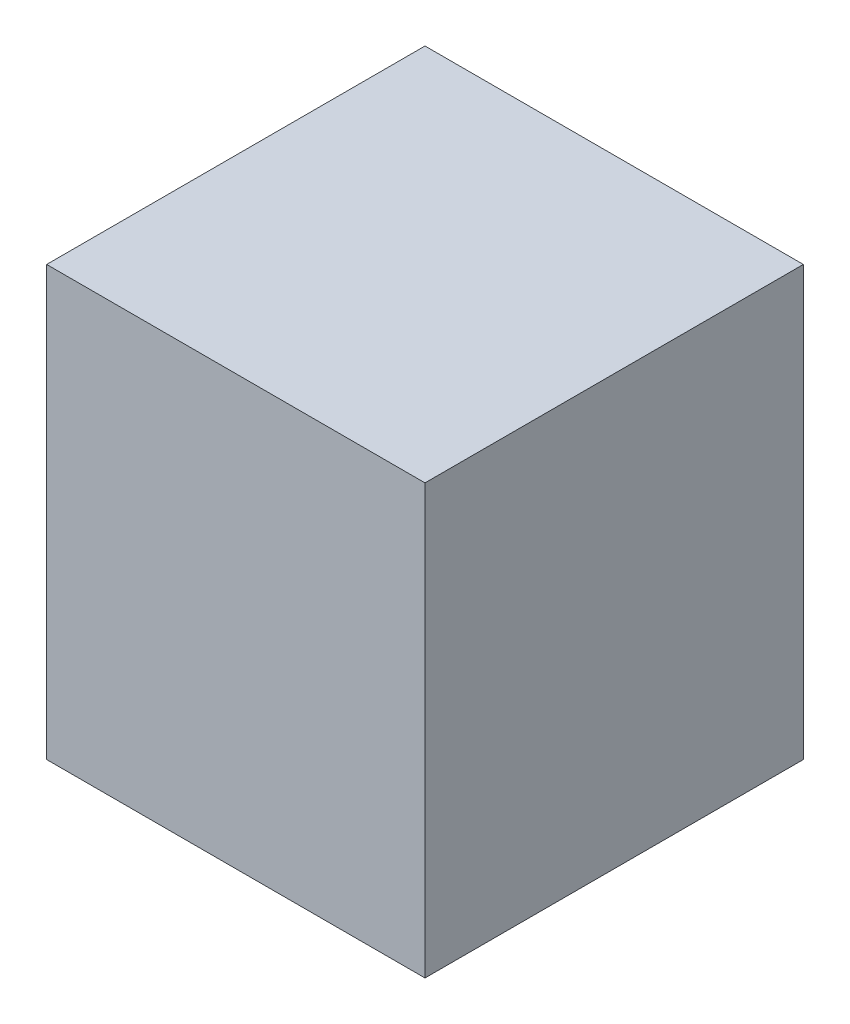
ISO-10303-21;
HEADER;
FILE_DESCRIPTION(('STEP AP214'),'2;1');
FILE_NAME('part.step','',(''),(''),'','','');
FILE_SCHEMA(('AUTOMOTIVE_DESIGN { 1 0 10303 214 1 1 1 1 }'));
ENDSEC;
DATA;
#1=APPLICATION_CONTEXT('core data for automotive mechanical design processes');
#2=APPLICATION_PROTOCOL_DEFINITION('international standard','automotive_design',2000,#1);
#3=PRODUCT_CONTEXT('',#1,'mechanical');
#4=PRODUCT('Part','Part','',(#3));
#5=PRODUCT_RELATED_PRODUCT_CATEGORY('part','',(#4));
#6=PRODUCT_DEFINITION_FORMATION('','',#4);
#7=PRODUCT_DEFINITION_CONTEXT('part definition',#1,'design');
#8=PRODUCT_DEFINITION('design','',#6,#7);
#9=PRODUCT_DEFINITION_SHAPE('','',#8);
#10=(LENGTH_UNIT() NAMED_UNIT(*) SI_UNIT(.MILLI.,.METRE.));
#11=(NAMED_UNIT(*) PLANE_ANGLE_UNIT() SI_UNIT($,.RADIAN.));
#12=(NAMED_UNIT(*) SI_UNIT($,.STERADIAN.) SOLID_ANGLE_UNIT());
#13=UNCERTAINTY_MEASURE_WITH_UNIT(LENGTH_MEASURE(1.E-05),#10,'distance_accuracy_value','');
#14=(GEOMETRIC_REPRESENTATION_CONTEXT(3) GLOBAL_UNCERTAINTY_ASSIGNED_CONTEXT((#13)) GLOBAL_UNIT_ASSIGNED_CONTEXT((#10,
#11,#12)) REPRESENTATION_CONTEXT('',''));
#15=CARTESIAN_POINT('',(0.,0.,0.));
#16=DIRECTION('',(0.,0.,1.));
#17=DIRECTION('',(1.,0.,0.));
#18=AXIS2_PLACEMENT_3D('',#15,#16,#17);
#19=CARTESIAN_POINT('',(-23.1019316502739,68.,-14.1413844252725));
#20=DIRECTION('',(1.,0.,0.));
#21=DIRECTION('',(0.,0.,-1.));
#22=AXIS2_PLACEMENT_3D('',#19,#20,#21);
#23=PLANE('',#22);
#24=DIRECTION('',(0.,0.,1.));
#25=VECTOR('',#24,1.);
#26=CARTESIAN_POINT('',(-23.1019316502739,0.,-14.1413844252725));
#27=LINE('',#26,#25);
#28=CARTESIAN_POINT('',(-23.1019316502739,0.,-14.1413844252725));
#29=VERTEX_POINT('',#28);
#30=CARTESIAN_POINT('',(-23.1019316502738,0.,45.8586155747275));
#31=VERTEX_POINT('',#30);
#32=EDGE_CURVE('E96',#29,#31,#27,.T.);
#33=ORIENTED_EDGE('',*,*,#32,.T.);
#34=DIRECTION('',(0.,-1.,0.));
#35=VECTOR('',#34,1.);
#36=CARTESIAN_POINT('',(-23.1019316502738,68.,45.8586155747275));
#37=LINE('',#36,#35);
#38=CARTESIAN_POINT('',(-23.1019316502738,68.,45.8586155747275));
#39=VERTEX_POINT('',#38);
#40=EDGE_CURVE('E11',#39,#31,#37,.T.);
#41=ORIENTED_EDGE('',*,*,#40,.F.);
#42=DIRECTION('',(0.,0.,1.));
#43=VECTOR('',#42,1.);
#44=CARTESIAN_POINT('',(-23.1019316502739,68.,-14.1413844252725));
#45=LINE('',#44,#43);
#46=CARTESIAN_POINT('',(-23.1019316502739,68.,-14.1413844252725));
#47=VERTEX_POINT('',#46);
#48=EDGE_CURVE('E84',#47,#39,#45,.T.);
#49=ORIENTED_EDGE('',*,*,#48,.F.);
#50=DIRECTION('',(0.,-1.,0.));
#51=VECTOR('',#50,1.);
#52=CARTESIAN_POINT('',(-23.1019316502739,68.,-14.1413844252725));
#53=LINE('',#52,#51);
#54=EDGE_CURVE('E92',#47,#29,#53,.T.);
#55=ORIENTED_EDGE('',*,*,#54,.T.);
#56=EDGE_LOOP('',(#33,#41,#49,#55));
#57=FACE_BOUND('',#56,.T.);
#58=ADVANCED_FACE('F33',(#57),#23,.F.);
#59=CARTESIAN_POINT('',(-23.1019316502738,68.,45.8586155747275));
#60=DIRECTION('',(0.,0.,-1.));
#61=DIRECTION('',(-1.,0.,0.));
#62=AXIS2_PLACEMENT_3D('',#59,#60,#61);
#63=PLANE('',#62);
#64=DIRECTION('',(1.,0.,0.));
#65=VECTOR('',#64,1.);
#66=CARTESIAN_POINT('',(-23.1019316502738,0.,45.8586155747275));
#67=LINE('',#66,#65);
#68=CARTESIAN_POINT('',(36.8980683497262,0.,45.8586155747275));
#69=VERTEX_POINT('',#68);
#70=EDGE_CURVE('E88',#31,#69,#67,.T.);
#71=ORIENTED_EDGE('',*,*,#70,.T.);
#72=DIRECTION('',(0.,-1.,0.));
#73=VECTOR('',#72,1.);
#74=CARTESIAN_POINT('',(36.8980683497262,68.,45.8586155747275));
#75=LINE('',#74,#73);
#76=CARTESIAN_POINT('',(36.8980683497262,68.,45.8586155747275));
#77=VERTEX_POINT('',#76);
#78=EDGE_CURVE('E41',#77,#69,#75,.T.);
#79=ORIENTED_EDGE('',*,*,#78,.F.);
#80=DIRECTION('',(1.,0.,0.));
#81=VECTOR('',#80,1.);
#82=CARTESIAN_POINT('',(-23.1019316502738,68.,45.8586155747275));
#83=LINE('',#82,#81);
#84=EDGE_CURVE('E79',#39,#77,#83,.T.);
#85=ORIENTED_EDGE('',*,*,#84,.F.);
#86=ORIENTED_EDGE('',*,*,#40,.T.);
#87=EDGE_LOOP('',(#71,#79,#85,#86));
#88=FACE_BOUND('',#87,.T.);
#89=ADVANCED_FACE('F87',(#88),#63,.F.);
#90=CARTESIAN_POINT('',(36.8980683497261,68.,-14.1413844252725));
#91=DIRECTION('',(-1.,0.,0.));
#92=DIRECTION('',(0.,0.,1.));
#93=AXIS2_PLACEMENT_3D('',#90,#91,#92);
#94=PLANE('',#93);
#95=DIRECTION('',(0.,0.,-1.));
#96=VECTOR('',#95,1.);
#97=CARTESIAN_POINT('',(36.8980683497261,0.,-14.1413844252725));
#98=LINE('',#97,#96);
#99=CARTESIAN_POINT('',(36.8980683497261,0.,-14.1413844252725));
#100=VERTEX_POINT('',#99);
#101=EDGE_CURVE('E66',#69,#100,#98,.T.);
#102=ORIENTED_EDGE('',*,*,#101,.T.);
#103=DIRECTION('',(0.,-1.,0.));
#104=VECTOR('',#103,1.);
#105=CARTESIAN_POINT('',(36.8980683497261,68.,-14.1413844252725));
#106=LINE('',#105,#104);
#107=CARTESIAN_POINT('',(36.8980683497261,68.,-14.1413844252725));
#108=VERTEX_POINT('',#107);
#109=EDGE_CURVE('E89',#108,#100,#106,.T.);
#110=ORIENTED_EDGE('',*,*,#109,.F.);
#111=DIRECTION('',(0.,0.,-1.));
#112=VECTOR('',#111,1.);
#113=CARTESIAN_POINT('',(36.8980683497261,68.,-14.1413844252725));
#114=LINE('',#113,#112);
#115=EDGE_CURVE('E82',#77,#108,#114,.T.);
#116=ORIENTED_EDGE('',*,*,#115,.F.);
#117=ORIENTED_EDGE('',*,*,#78,.T.);
#118=EDGE_LOOP('',(#102,#110,#116,#117));
#119=FACE_BOUND('',#118,.T.);
#120=ADVANCED_FACE('F90',(#119),#94,.F.);
#121=CARTESIAN_POINT('',(-23.1019316502739,68.,-14.1413844252725));
#122=DIRECTION('',(0.,0.,1.));
#123=DIRECTION('',(1.,0.,0.));
#124=AXIS2_PLACEMENT_3D('',#121,#122,#123);
#125=PLANE('',#124);
#126=DIRECTION('',(-1.,0.,0.));
#127=VECTOR('',#126,1.);
#128=CARTESIAN_POINT('',(-23.1019316502739,0.,-14.1413844252725));
#129=LINE('',#128,#127);
#130=EDGE_CURVE('E72',#100,#29,#129,.T.);
#131=ORIENTED_EDGE('',*,*,#130,.T.);
#132=ORIENTED_EDGE('',*,*,#54,.F.);
#133=DIRECTION('',(-1.,0.,0.));
#134=VECTOR('',#133,1.);
#135=CARTESIAN_POINT('',(-23.1019316502739,68.,-14.1413844252725));
#136=LINE('',#135,#134);
#137=EDGE_CURVE('E49',#108,#47,#136,.T.);
#138=ORIENTED_EDGE('',*,*,#137,.F.);
#139=ORIENTED_EDGE('',*,*,#109,.T.);
#140=EDGE_LOOP('',(#131,#132,#138,#139));
#141=FACE_BOUND('',#140,.T.);
#142=ADVANCED_FACE('F103',(#141),#125,.F.);
#143=CARTESIAN_POINT('',(0.,68.,0.));
#144=DIRECTION('',(0.,1.,0.));
#145=DIRECTION('',(0.,0.,1.));
#146=AXIS2_PLACEMENT_3D('',#143,#144,#145);
#147=PLANE('',#146);
#148=ORIENTED_EDGE('',*,*,#48,.T.);
#149=ORIENTED_EDGE('',*,*,#84,.T.);
#150=ORIENTED_EDGE('',*,*,#115,.T.);
#151=ORIENTED_EDGE('',*,*,#137,.T.);
#152=EDGE_LOOP('',(#148,#149,#150,#151));
#153=FACE_BOUND('',#152,.T.);
#154=ADVANCED_FACE('F80',(#153),#147,.T.);
#155=CARTESIAN_POINT('',(0.,0.,0.));
#156=DIRECTION('',(0.,1.,0.));
#157=DIRECTION('',(0.,0.,1.));
#158=AXIS2_PLACEMENT_3D('',#155,#156,#157);
#159=PLANE('',#158);
#160=ORIENTED_EDGE('',*,*,#32,.F.);
#161=ORIENTED_EDGE('',*,*,#130,.F.);
#162=ORIENTED_EDGE('',*,*,#101,.F.);
#163=ORIENTED_EDGE('',*,*,#70,.F.);
#164=EDGE_LOOP('',(#160,#161,#162,#163));
#165=FACE_BOUND('',#164,.T.);
#166=ADVANCED_FACE('F106',(#165),#159,.F.);
#167=CLOSED_SHELL('',(#58,#89,#120,#142,#154,#166));
#168=MANIFOLD_SOLID_BREP('B2',#167);
#169=ADVANCED_BREP_SHAPE_REPRESENTATION('',(#18,#168),#14);
#170=SHAPE_DEFINITION_REPRESENTATION(#9,#169);
ENDSEC;
END-ISO-10303-21;
